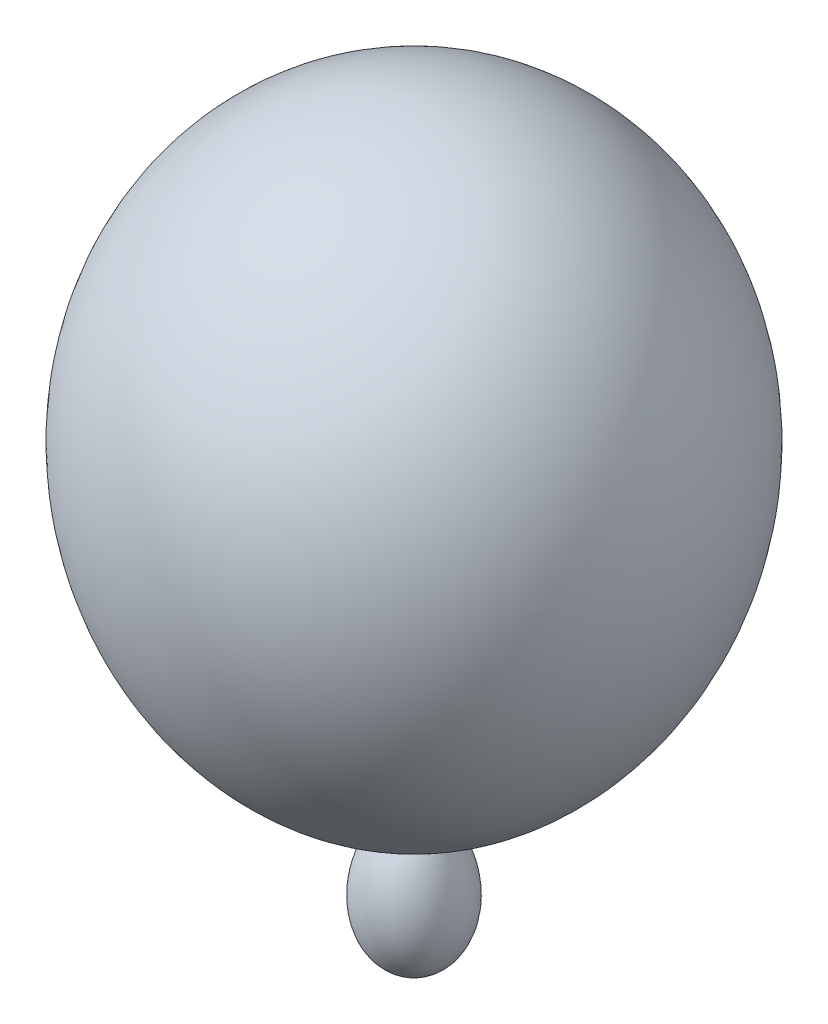
ISO-10303-21;
HEADER;
FILE_DESCRIPTION(('STEP AP214'),'2;1');
FILE_NAME('part.step','',(''),(''),'','','');
FILE_SCHEMA(('AUTOMOTIVE_DESIGN { 1 0 10303 214 1 1 1 1 }'));
ENDSEC;
DATA;
#1=APPLICATION_CONTEXT('core data for automotive mechanical design processes');
#2=APPLICATION_PROTOCOL_DEFINITION('international standard','automotive_design',2000,#1);
#3=PRODUCT_CONTEXT('',#1,'mechanical');
#4=PRODUCT('Part','Part','',(#3));
#5=PRODUCT_RELATED_PRODUCT_CATEGORY('part','',(#4));
#6=PRODUCT_DEFINITION_FORMATION('','',#4);
#7=PRODUCT_DEFINITION_CONTEXT('part definition',#1,'design');
#8=PRODUCT_DEFINITION('design','',#6,#7);
#9=PRODUCT_DEFINITION_SHAPE('','',#8);
#10=(LENGTH_UNIT() NAMED_UNIT(*) SI_UNIT(.MILLI.,.METRE.));
#11=(NAMED_UNIT(*) PLANE_ANGLE_UNIT() SI_UNIT($,.RADIAN.));
#12=(NAMED_UNIT(*) SI_UNIT($,.STERADIAN.) SOLID_ANGLE_UNIT());
#13=UNCERTAINTY_MEASURE_WITH_UNIT(LENGTH_MEASURE(1.E-05),#10,'distance_accuracy_value','');
#14=(GEOMETRIC_REPRESENTATION_CONTEXT(3) GLOBAL_UNCERTAINTY_ASSIGNED_CONTEXT((#13)) GLOBAL_UNIT_ASSIGNED_CONTEXT((#10,
#11,#12)) REPRESENTATION_CONTEXT('',''));
#15=CARTESIAN_POINT('',(0.,0.,0.));
#16=DIRECTION('',(0.,0.,1.));
#17=DIRECTION('',(1.,0.,0.));
#18=AXIS2_PLACEMENT_3D('',#15,#16,#17);
#19=CARTESIAN_POINT('',(-1.0398853970985E-11,-79.5774715459477,0.));
#20=CARTESIAN_POINT('',(0.0876805923341404,-79.5774715459478,0.));
#21=CARTESIAN_POINT('',(0.263797972575064,-79.5762299115467,0.));
#22=CARTESIAN_POINT('',(0.598650590856886,-79.5706425508887,0.));
#23=CARTESIAN_POINT('',(0.950876652571486,-79.5557486563722,0.));
#24=CARTESIAN_POINT('',(1.35262547212403,-79.5334221241474,0.));
#25=CARTESIAN_POINT('',(1.72703176838669,-79.5036800391544,0.));
#26=CARTESIAN_POINT('',(2.11530944355549,-79.4665451551406,0.));
#27=CARTESIAN_POINT('',(2.49518978074726,-79.4220456154996,0.));
#28=CARTESIAN_POINT('',(2.97332683239408,-79.357257557479,0.));
#29=CARTESIAN_POINT('',(3.54269888813024,-79.264927606383,0.));
#30=CARTESIAN_POINT('',(4.20460476573237,-79.1361341339061,0.));
#31=CARTESIAN_POINT('',(4.95420601058507,-78.9604694530783,0.));
#32=CARTESIAN_POINT('',(5.88274142070473,-78.7059305412052,0.));
#33=CARTESIAN_POINT('',(6.98062102196149,-78.3456897199416,0.));
#34=CARTESIAN_POINT('',(8.05511024966161,-77.9193233853256,0.));
#35=CARTESIAN_POINT('',(9.10205208383472,-77.4304669791197,0.));
#36=CARTESIAN_POINT('',(9.95460225664503,-76.9834055975815,0.));
#37=CARTESIAN_POINT('',(10.6240501917869,-76.6027582295668,0.));
#38=CARTESIAN_POINT('',(11.4444934505436,-76.0992379641618,0.));
#39=CARTESIAN_POINT('',(12.4018408014167,-75.4523461029347,0.));
#40=CARTESIAN_POINT('',(13.477279244194,-74.6390919759678,0.));
#41=CARTESIAN_POINT('',(14.6469295160346,-73.6360306984476,0.));
#42=CARTESIAN_POINT('',(16.0324846638131,-72.2982632564667,0.));
#43=CARTESIAN_POINT('',(17.5703966008741,-70.5710496856625,0.));
#44=CARTESIAN_POINT('',(19.0328275386001,-68.6021378476665,0.));
#45=CARTESIAN_POINT('',(20.3892255649037,-66.3962176969675,0.));
#46=CARTESIAN_POINT('',(21.5824370302139,-64.0991845678398,0.));
#47=CARTESIAN_POINT('',(22.4618657728492,-62.078453783561,0.));
#48=CARTESIAN_POINT('',(23.1713994969415,-60.1395719774442,0.));
#49=CARTESIAN_POINT('',(24.0780617054906,-57.195387525395,0.));
#50=CARTESIAN_POINT('',(24.931218987006,-53.4348933087704,0.));
#51=CARTESIAN_POINT('',(25.5220972050229,-48.4503546408996,0.));
#52=CARTESIAN_POINT('',(25.4671494748604,-42.275747962825,0.));
#53=CARTESIAN_POINT('',(24.6891735038918,-36.1519800546308,0.));
#54=CARTESIAN_POINT('',(23.237769759558,-30.1532766900786,0.));
#55=CARTESIAN_POINT('',(21.1535663445063,-24.3446370051788,0.));
#56=CARTESIAN_POINT('',(18.468657066632,-18.7882038275258,0.));
#57=CARTESIAN_POINT('',(15.2067873874591,-13.5488188649898,0.));
#58=CARTESIAN_POINT('',(11.8635522330858,-9.31351533749863,0.));
#59=CARTESIAN_POINT('',(8.65194495273465,-5.99775760871078,0.));
#60=CARTESIAN_POINT('',(6.02821040277064,-3.74744605475118,0.));
#61=CARTESIAN_POINT('',(4.18687293272993,-2.36896894898637,0.));
#62=CARTESIAN_POINT('',(2.79098993640259,-1.4557689738408,0.));
#63=CARTESIAN_POINT('',(1.89911185390225,-0.927774967500933,0.));
#64=CARTESIAN_POINT('',(1.20891495810726,-0.555188094697185,0.));
#65=CARTESIAN_POINT('',(0.792765610770951,-0.345754338027514,0.));
#66=CARTESIAN_POINT('',(0.430888145668768,-0.176914065924159,0.));
#67=CARTESIAN_POINT('',(0.186212553313267,-0.0719592793469132,0.));
#68=CARTESIAN_POINT('',(0.0623290833588892,-0.023341488057453,0.));
#69=CARTESIAN_POINT('',(-6.9406626701159E-12,0.,0.));
#70=B_SPLINE_CURVE_WITH_KNOTS('',4,(#19,#20,#21,#22,#23,#24,#25,#26,#27,#28,#29,#30,#31,#32,#33,
#34,#35,#36,#37,#38,#39,#40,#41,#42,#43,#44,#45,#46,#47,#48,#49,#50,#51,#52,#53,#54,#55,#56,#57,
#58,#59,#60,#61,#62,#63,#64,#65,#66,#67,#68,#69),.UNSPECIFIED.,.F.,.F.,(5,1,1,1,1,1,1,1,1,1,1,1,
1,1,1,1,1,1,1,1,1,1,1,1,1,1,1,1,1,1,1,1,1,1,1,1,1,1,1,1,1,1,1,1,1,1,1,5),(0.0889842727979694,
0.0924312928800519,0.0958783129621343,0.0993253330442168,0.102772353126299,0.106219373208382,
0.109666393290464,0.113113413372547,0.116560433454629,0.123454483320074,0.130348533185519,
0.137242583050964,0.144136632916409,0.157924696562186,0.171712760207964,0.178606822642936,
0.185500885077909,0.192394947512881,0.199289009947854,0.213077084610209,0.226865159272564,
0.240653288577068,0.254441417881571,0.282017661504337,0.309593764096882,0.32834201604834,
0.347090267999798,0.374666472698493,0.388454575047841,0.402242677397188,0.457395073933465,
0.512547464731353,0.567699899774951,0.622852335697732,0.678004748424371,0.733157135249234,
0.788309674961777,0.84346197685155,0.898614443046644,0.925986448179912,0.953358453313181,
0.967146068268635,0.980933683224089,0.985700262418067,0.990466841612045,0.995233420806022,
0.997616710403011,1.),.UNSPECIFIED.);
#71=CARTESIAN_POINT('',(-6.9309172405346E-12,-79.5774715459477,0.));
#72=DIRECTION('',(0.,-1.,0.));
#73=AXIS1_PLACEMENT('',#71,#72);
#74=SURFACE_OF_REVOLUTION('',#70,#73);
#75=CARTESIAN_POINT('',(-6.9309172405346E-12,0.,0.));
#76=VERTEX_POINT('',#75);
#77=VERTEX_LOOP('',#76);
#78=FACE_BOUND('',#77,.T.);
#79=CARTESIAN_POINT('',(-6.9309172405346E-12,-79.5774715459477,0.));
#80=VERTEX_POINT('',#79);
#81=VERTEX_LOOP('',#80);
#82=FACE_BOUND('',#81,.T.);
#83=ADVANCED_FACE('P0_F15',(#78,#82),#74,.F.);
#84=CLOSED_SHELL('',(#83));
#85=MANIFOLD_SOLID_BREP('P0_B1',#84);
#86=CARTESIAN_POINT('',(1.41146710431532E-11,0.,0.));
#87=CARTESIAN_POINT('',(0.0859484376262017,-0.0282662684604244,0.));
#88=CARTESIAN_POINT('',(0.258741266043385,-0.0818126349667669,0.));
#89=CARTESIAN_POINT('',(0.607975906154392,-0.176773899432167,0.));
#90=CARTESIAN_POINT('',(1.13648443868247,-0.300694334369223,0.));
#91=CARTESIAN_POINT('',(1.75736046841581,-0.425492273985936,0.));
#92=CARTESIAN_POINT('',(2.47092487411519,-0.546444597975775,0.));
#93=CARTESIAN_POINT('',(3.18729849219299,-0.6491842073489,0.));
#94=CARTESIAN_POINT('',(3.90581284062354,-0.735687541069568,0.));
#95=CARTESIAN_POINT('',(4.62591371099559,-0.807603315987792,0.));
#96=CARTESIAN_POINT('',(5.76656639695076,-0.899989174711032,0.));
#97=CARTESIAN_POINT('',(7.32997146589355,-0.978373944070118,0.));
#98=CARTESIAN_POINT('',(9.31621460960801,-1.0015369923337,0.));
#99=CARTESIAN_POINT('',(11.7220271185774,-0.925628511429962,0.));
#100=CARTESIAN_POINT('',(14.3971716622839,-0.73790074574666,0.));
#101=CARTESIAN_POINT('',(17.3358932630275,-0.411989058645636,0.));
#102=CARTESIAN_POINT('',(20.5303576412977,0.0772355685000593,0.));
#103=CARTESIAN_POINT('',(23.9707996083012,0.753981371578221,0.));
#104=CARTESIAN_POINT('',(28.2347700624499,1.76756874603618,0.));
#105=CARTESIAN_POINT('',(33.2872704304692,3.23246337930188,0.));
#106=CARTESIAN_POINT('',(39.0780254717897,5.26931887182034,0.));
#107=CARTESIAN_POINT('',(45.539794960055,7.99882327547519,0.));
#108=CARTESIAN_POINT('',(53.1168259302294,11.7233962445402,0.));
#109=CARTESIAN_POINT('',(61.6611172805564,16.6752284001241,0.));
#110=CARTESIAN_POINT('',(74.1380836324685,25.2582387937832,0.));
#111=CARTESIAN_POINT('',(89.4923341094344,38.7566394707688,0.));
#112=CARTESIAN_POINT('',(105.334527051208,57.2109254431687,0.));
#113=CARTESIAN_POINT('',(120.029622867611,81.2294987615516,0.));
#114=CARTESIAN_POINT('',(130.843845704351,107.221766290394,0.));
#115=CARTESIAN_POINT('',(137.570745820491,134.558138538383,0.));
#116=CARTESIAN_POINT('',(140.025513533455,162.605947230255,0.));
#117=CARTESIAN_POINT('',(138.301043696831,187.186959393694,0.));
#118=CARTESIAN_POINT('',(133.992044155786,207.830556302757,0.));
#119=CARTESIAN_POINT('',(128.506752773258,224.498756482363,0.));
#120=CARTESIAN_POINT('',(122.98652847123,237.406769960268,0.));
#121=CARTESIAN_POINT('',(116.34720576717,249.777600476556,0.));
#122=CARTESIAN_POINT('',(109.579249051985,260.031141948827,0.));
#123=CARTESIAN_POINT('',(103.115808939633,268.337765834442,0.));
#124=CARTESIAN_POINT('',(96.1413567074445,276.213295476677,0.));
#125=CARTESIAN_POINT('',(88.6704255209011,283.627502930023,0.));
#126=CARTESIAN_POINT('',(79.671165034008,291.198206100322,0.));
#127=CARTESIAN_POINT('',(69.8927448485144,297.935366193862,0.));
#128=CARTESIAN_POINT('',(61.1222441539041,302.970615340565,0.));
#129=CARTESIAN_POINT('',(54.4052809333182,306.259537852515,0.));
#130=CARTESIAN_POINT('',(49.4752279922986,308.402261200091,0.));
#131=CARTESIAN_POINT('',(45.3967415433711,310.005002011626,0.));
#132=CARTESIAN_POINT('',(42.1007772880208,311.199361520453,0.));
#133=CARTESIAN_POINT('',(38.7739053085125,312.304684986551,0.));
#134=CARTESIAN_POINT('',(35.4184007172713,313.319846846936,0.));
#135=CARTESIAN_POINT('',(32.0366731147342,314.2438026592,0.));
#136=CARTESIAN_POINT('',(28.6310504400938,315.075592838871,0.));
#137=CARTESIAN_POINT('',(25.2041239903591,315.814346188175,0.));
#138=CARTESIAN_POINT('',(21.7581668819248,316.459283049553,0.));
#139=CARTESIAN_POINT('',(18.2960958721629,317.009718133361,0.));
#140=CARTESIAN_POINT('',(15.2543316251859,317.408144998869,0.));
#141=CARTESIAN_POINT('',(12.6407341636367,317.689916768168,0.));
#142=CARTESIAN_POINT('',(10.4579002422329,317.884780671021,0.));
#143=CARTESIAN_POINT('',(8.71145682890226,318.016662169121,0.));
#144=CARTESIAN_POINT('',(7.01718597563807,318.120951145697,0.));
#145=CARTESIAN_POINT('',(5.38617227190987,318.200188685147,0.));
#146=CARTESIAN_POINT('',(3.9899694364865,318.250002448526,0.));
#147=CARTESIAN_POINT('',(2.86155279063243,318.279563873678,0.));
#148=CARTESIAN_POINT('',(1.88839935742031,318.296619795261,0.));
#149=CARTESIAN_POINT('',(1.17505896639695,318.305716673976,0.));
#150=CARTESIAN_POINT('',(0.523129219152612,318.309128091201,0.));
#151=CARTESIAN_POINT('',(0.17295736899519,318.309886183791,0.));
#152=CARTESIAN_POINT('',(2.12969130492851E-11,318.309886183791,0.));
#153=B_SPLINE_CURVE_WITH_KNOTS('',4,(#86,#87,#88,#89,#90,#91,#92,#93,#94,#95,#96,#97,#98,#99,
#100,#101,#102,#103,#104,#105,#106,#107,#108,#109,#110,#111,#112,#113,#114,#115,#116,#117,#118,
#119,#120,#121,#122,#123,#124,#125,#126,#127,#128,#129,#130,#131,#132,#133,#134,#135,#136,#137,
#138,#139,#140,#141,#142,#143,#144,#145,#146,#147,#148,#149,#150,#151,#152),.UNSPECIFIED.,.F.,
.F.,(5,1,1,1,1,1,1,1,1,1,1,1,1,1,1,1,1,1,1,1,1,1,1,1,1,1,1,1,1,1,1,1,1,1,1,1,1,1,1,1,1,1,1,1,1,
1,1,1,1,1,1,1,1,1,1,1,1,1,1,1,1,1,1,5),(0.,0.000700683276676628,0.00140136655335326,
0.00280273310670651,0.00420409966005977,0.00560546621341302,0.00700683276676628,
0.00840819932011953,0.00980956587347279,0.011210932426826,0.0158709471347707,0.0205309618427154,
0.0251909765506601,0.0298509912586048,0.0366394053159713,0.0434278193733378,0.0502162334307044,
0.0570046474880709,0.0705809872013024,0.084157326914534,0.0977336932649558,0.111310059615378,
0.135947468736871,0.160584877858364,0.214889816252771,0.269194757123992,0.323499694564589,
0.377804649046081,0.432109552594019,0.486414487618962,0.540719415674479,0.567871876520598,
0.595024337366718,0.622176786647345,0.649329235927972,0.676481693932103,0.690057922934169,
0.703634151936234,0.730786602148666,0.757939052361099,0.781003168764148,0.795479323702256,
0.80905555597644,0.815843672113531,0.82263178376121,0.829419895408888,0.836208007056566,
0.842996118704244,0.849784231243136,0.856572343782029,0.863360456320921,0.870148568859813,
0.876936683774392,0.883724798688972,0.887118856146262,0.890512913603552,0.893906971060842,
0.897301028518132,0.900248500978057,0.903195973437981,0.904669709667943,0.906143445897905,
0.907617182127867,0.90909091835783),.UNSPECIFIED.);
#154=CARTESIAN_POINT('',(1.59677390484893E-11,318.309886183791,0.));
#155=DIRECTION('',(0.,1.,0.));
#156=AXIS1_PLACEMENT('',#154,#155);
#157=SURFACE_OF_REVOLUTION('',#153,#156);
#158=CARTESIAN_POINT('',(1.59677390484893E-11,318.309886183791,0.));
#159=VERTEX_POINT('',#158);
#160=VERTEX_LOOP('',#159);
#161=FACE_BOUND('',#160,.T.);
#162=CARTESIAN_POINT('',(1.41146710431532E-11,0.,0.));
#163=VERTEX_POINT('',#162);
#164=VERTEX_LOOP('',#163);
#165=FACE_BOUND('',#164,.T.);
#166=ADVANCED_FACE('P1_F16',(#161,#165),#157,.T.);
#167=CLOSED_SHELL('',(#166));
#168=MANIFOLD_SOLID_BREP('P1_B1',#167);
#169=ADVANCED_BREP_SHAPE_REPRESENTATION('',(#18,#85,#168),#14);
#170=SHAPE_DEFINITION_REPRESENTATION(#9,#169);
ENDSEC;
END-ISO-10303-21;
